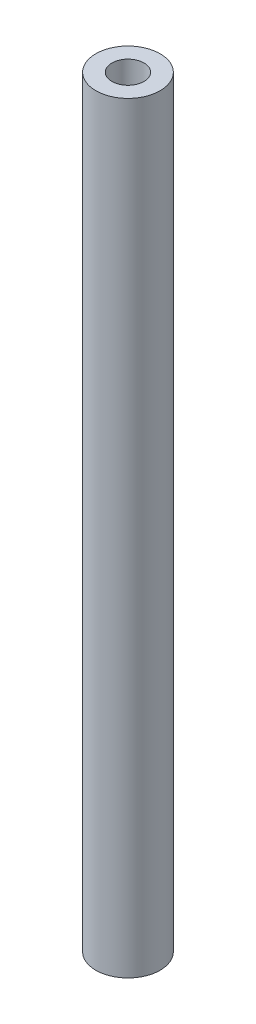
ISO-10303-21;
HEADER;
FILE_DESCRIPTION(('STEP AP214'),'2;1');
FILE_NAME('part.step','',(''),(''),'','','');
FILE_SCHEMA(('AUTOMOTIVE_DESIGN { 1 0 10303 214 1 1 1 1 }'));
ENDSEC;
DATA;
#1=APPLICATION_CONTEXT('core data for automotive mechanical design processes');
#2=APPLICATION_PROTOCOL_DEFINITION('international standard','automotive_design',2000,#1);
#3=PRODUCT_CONTEXT('',#1,'mechanical');
#4=PRODUCT('Part','Part','',(#3));
#5=PRODUCT_RELATED_PRODUCT_CATEGORY('part','',(#4));
#6=PRODUCT_DEFINITION_FORMATION('','',#4);
#7=PRODUCT_DEFINITION_CONTEXT('part definition',#1,'design');
#8=PRODUCT_DEFINITION('design','',#6,#7);
#9=PRODUCT_DEFINITION_SHAPE('','',#8);
#10=(LENGTH_UNIT() NAMED_UNIT(*) SI_UNIT(.MILLI.,.METRE.));
#11=(NAMED_UNIT(*) PLANE_ANGLE_UNIT() SI_UNIT($,.RADIAN.));
#12=(NAMED_UNIT(*) SI_UNIT($,.STERADIAN.) SOLID_ANGLE_UNIT());
#13=UNCERTAINTY_MEASURE_WITH_UNIT(LENGTH_MEASURE(1.E-05),#10,'distance_accuracy_value','');
#14=(GEOMETRIC_REPRESENTATION_CONTEXT(3) GLOBAL_UNCERTAINTY_ASSIGNED_CONTEXT((#13)) GLOBAL_UNIT_ASSIGNED_CONTEXT((#10,
#11,#12)) REPRESENTATION_CONTEXT('',''));
#15=CARTESIAN_POINT('',(0.,0.,0.));
#16=DIRECTION('',(0.,0.,1.));
#17=DIRECTION('',(1.,0.,0.));
#18=AXIS2_PLACEMENT_3D('',#15,#16,#17);
#19=CARTESIAN_POINT('',(0.,113.,0.));
#20=DIRECTION('',(0.,-1.,0.));
#21=DIRECTION('',(0.,0.,-1.));
#22=AXIS2_PLACEMENT_3D('',#19,#20,#21);
#23=CYLINDRICAL_SURFACE('',#22,4.7625);
#24=CARTESIAN_POINT('',(0.,113.,0.));
#25=DIRECTION('',(0.,1.,0.));
#26=DIRECTION('',(0.,0.,1.));
#27=AXIS2_PLACEMENT_3D('',#24,#25,#26);
#28=CIRCLE('',#27,4.7625);
#29=CARTESIAN_POINT('',(0.,113.,4.7625));
#30=VERTEX_POINT('',#29);
#31=EDGE_CURVE('E10',#30,#30,#28,.T.);
#32=ORIENTED_EDGE('',*,*,#31,.F.);
#33=EDGE_LOOP('',(#32));
#34=FACE_BOUND('',#33,.T.);
#35=CARTESIAN_POINT('',(0.,0.,0.));
#36=DIRECTION('',(0.,1.,0.));
#37=DIRECTION('',(0.,0.,1.));
#38=AXIS2_PLACEMENT_3D('',#35,#36,#37);
#39=CIRCLE('',#38,4.7625);
#40=CARTESIAN_POINT('',(0.,0.,4.7625));
#41=VERTEX_POINT('',#40);
#42=EDGE_CURVE('E43',#41,#41,#39,.T.);
#43=ORIENTED_EDGE('',*,*,#42,.T.);
#44=EDGE_LOOP('',(#43));
#45=FACE_BOUND('',#44,.T.);
#46=ADVANCED_FACE('F40',(#34,#45),#23,.T.);
#47=CARTESIAN_POINT('',(0.,113.,0.));
#48=DIRECTION('',(0.,1.,0.));
#49=DIRECTION('',(0.,0.,1.));
#50=AXIS2_PLACEMENT_3D('',#47,#48,#49);
#51=PLANE('',#50);
#52=CARTESIAN_POINT('',(0.,113.,0.));
#53=DIRECTION('',(0.,1.,0.));
#54=DIRECTION('',(0.,0.,1.));
#55=AXIS2_PLACEMENT_3D('',#52,#53,#54);
#56=CIRCLE('',#55,2.38125);
#57=CARTESIAN_POINT('',(0.,113.,2.38125));
#58=VERTEX_POINT('',#57);
#59=EDGE_CURVE('E54',#58,#58,#56,.T.);
#60=ORIENTED_EDGE('',*,*,#59,.F.);
#61=EDGE_LOOP('',(#60));
#62=FACE_BOUND('',#61,.T.);
#63=ORIENTED_EDGE('',*,*,#31,.T.);
#64=EDGE_LOOP('',(#63));
#65=FACE_BOUND('',#64,.T.);
#66=ADVANCED_FACE('F82',(#62,#65),#51,.T.);
#67=CARTESIAN_POINT('',(0.,0.,0.));
#68=DIRECTION('',(0.,1.,0.));
#69=DIRECTION('',(0.,0.,1.));
#70=AXIS2_PLACEMENT_3D('',#67,#68,#69);
#71=PLANE('',#70);
#72=CARTESIAN_POINT('',(0.,0.,0.));
#73=DIRECTION('',(0.,1.,0.));
#74=DIRECTION('',(0.,0.,1.));
#75=AXIS2_PLACEMENT_3D('',#72,#73,#74);
#76=CIRCLE('',#75,2.38125);
#77=CARTESIAN_POINT('',(0.,0.,2.38125));
#78=VERTEX_POINT('',#77);
#79=EDGE_CURVE('E62',#78,#78,#76,.T.);
#80=ORIENTED_EDGE('',*,*,#79,.T.);
#81=EDGE_LOOP('',(#80));
#82=FACE_BOUND('',#81,.T.);
#83=ORIENTED_EDGE('',*,*,#42,.F.);
#84=EDGE_LOOP('',(#83));
#85=FACE_BOUND('',#84,.T.);
#86=ADVANCED_FACE('F88',(#82,#85),#71,.F.);
#87=CARTESIAN_POINT('',(0.,103.,0.));
#88=DIRECTION('',(0.,1.,0.));
#89=DIRECTION('',(0.,0.,1.));
#90=AXIS2_PLACEMENT_3D('',#87,#88,#89);
#91=CYLINDRICAL_SURFACE('',#90,2.38125);
#92=CARTESIAN_POINT('',(0.,103.,0.));
#93=DIRECTION('',(0.,1.,0.));
#94=DIRECTION('',(0.,0.,1.));
#95=AXIS2_PLACEMENT_3D('',#92,#93,#94);
#96=CIRCLE('',#95,2.38125);
#97=CARTESIAN_POINT('',(0.,103.,2.38125));
#98=VERTEX_POINT('',#97);
#99=EDGE_CURVE('E52',#98,#98,#96,.T.);
#100=ORIENTED_EDGE('',*,*,#99,.F.);
#101=EDGE_LOOP('',(#100));
#102=FACE_BOUND('',#101,.T.);
#103=ORIENTED_EDGE('',*,*,#59,.T.);
#104=EDGE_LOOP('',(#103));
#105=FACE_BOUND('',#104,.T.);
#106=ADVANCED_FACE('F95',(#102,#105),#91,.F.);
#107=CARTESIAN_POINT('',(0.,103.,0.));
#108=DIRECTION('',(0.,1.,0.));
#109=DIRECTION('',(0.,0.,1.));
#110=AXIS2_PLACEMENT_3D('',#107,#108,#109);
#111=PLANE('',#110);
#112=ORIENTED_EDGE('',*,*,#99,.T.);
#113=EDGE_LOOP('',(#112));
#114=FACE_BOUND('',#113,.T.);
#115=ADVANCED_FACE('F79',(#114),#111,.T.);
#116=CARTESIAN_POINT('',(0.,10.,0.));
#117=DIRECTION('',(0.,-1.,0.));
#118=DIRECTION('',(0.,0.,-1.));
#119=AXIS2_PLACEMENT_3D('',#116,#117,#118);
#120=CYLINDRICAL_SURFACE('',#119,2.38125);
#121=CARTESIAN_POINT('',(0.,10.,0.));
#122=DIRECTION('',(0.,1.,0.));
#123=DIRECTION('',(0.,0.,1.));
#124=AXIS2_PLACEMENT_3D('',#121,#122,#123);
#125=CIRCLE('',#124,2.38125);
#126=CARTESIAN_POINT('',(0.,10.,2.38125));
#127=VERTEX_POINT('',#126);
#128=EDGE_CURVE('E58',#127,#127,#125,.T.);
#129=ORIENTED_EDGE('',*,*,#128,.T.);
#130=EDGE_LOOP('',(#129));
#131=FACE_BOUND('',#130,.T.);
#132=ORIENTED_EDGE('',*,*,#79,.F.);
#133=EDGE_LOOP('',(#132));
#134=FACE_BOUND('',#133,.T.);
#135=ADVANCED_FACE('F70',(#131,#134),#120,.F.);
#136=CARTESIAN_POINT('',(0.,10.,0.));
#137=DIRECTION('',(0.,-1.,0.));
#138=DIRECTION('',(0.,0.,1.));
#139=AXIS2_PLACEMENT_3D('',#136,#137,#138);
#140=PLANE('',#139);
#141=ORIENTED_EDGE('',*,*,#128,.F.);
#142=EDGE_LOOP('',(#141));
#143=FACE_BOUND('',#142,.T.);
#144=ADVANCED_FACE('F73',(#143),#140,.T.);
#145=CLOSED_SHELL('',(#46,#66,#86,#106,#115,#135,#144));
#146=MANIFOLD_SOLID_BREP('B2',#145);
#147=ADVANCED_BREP_SHAPE_REPRESENTATION('',(#18,#146),#14);
#148=SHAPE_DEFINITION_REPRESENTATION(#9,#147);
ENDSEC;
END-ISO-10303-21;
